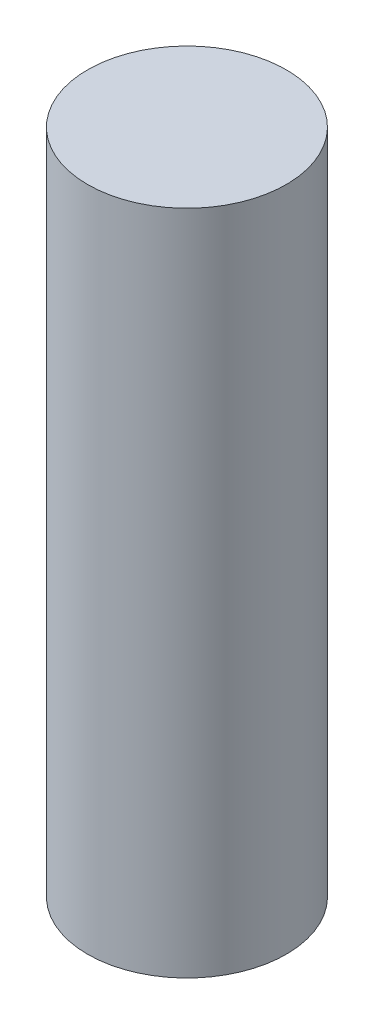
ISO-10303-21;
HEADER;
FILE_DESCRIPTION(('STEP AP214'),'2;1');
FILE_NAME('part.step','',(''),(''),'','','');
FILE_SCHEMA(('AUTOMOTIVE_DESIGN { 1 0 10303 214 1 1 1 1 }'));
ENDSEC;
DATA;
#1=APPLICATION_CONTEXT('core data for automotive mechanical design processes');
#2=APPLICATION_PROTOCOL_DEFINITION('international standard','automotive_design',2000,#1);
#3=PRODUCT_CONTEXT('',#1,'mechanical');
#4=PRODUCT('Part','Part','',(#3));
#5=PRODUCT_RELATED_PRODUCT_CATEGORY('part','',(#4));
#6=PRODUCT_DEFINITION_FORMATION('','',#4);
#7=PRODUCT_DEFINITION_CONTEXT('part definition',#1,'design');
#8=PRODUCT_DEFINITION('design','',#6,#7);
#9=PRODUCT_DEFINITION_SHAPE('','',#8);
#10=(LENGTH_UNIT() NAMED_UNIT(*) SI_UNIT(.MILLI.,.METRE.));
#11=(NAMED_UNIT(*) PLANE_ANGLE_UNIT() SI_UNIT($,.RADIAN.));
#12=(NAMED_UNIT(*) SI_UNIT($,.STERADIAN.) SOLID_ANGLE_UNIT());
#13=UNCERTAINTY_MEASURE_WITH_UNIT(LENGTH_MEASURE(1.E-05),#10,'distance_accuracy_value','');
#14=(GEOMETRIC_REPRESENTATION_CONTEXT(3) GLOBAL_UNCERTAINTY_ASSIGNED_CONTEXT((#13)) GLOBAL_UNIT_ASSIGNED_CONTEXT((#10,
#11,#12)) REPRESENTATION_CONTEXT('',''));
#15=CARTESIAN_POINT('',(0.,0.,0.));
#16=DIRECTION('',(0.,0.,1.));
#17=DIRECTION('',(1.,0.,0.));
#18=AXIS2_PLACEMENT_3D('',#15,#16,#17);
#19=CARTESIAN_POINT('',(0.,27.,0.));
#20=DIRECTION('',(0.,-1.,0.));
#21=DIRECTION('',(0.,0.,-1.));
#22=AXIS2_PLACEMENT_3D('',#19,#20,#21);
#23=CYLINDRICAL_SURFACE('',#22,4.025);
#24=CARTESIAN_POINT('',(0.,27.,0.));
#25=DIRECTION('',(0.,1.,0.));
#26=DIRECTION('',(0.,0.,1.));
#27=AXIS2_PLACEMENT_3D('',#24,#25,#26);
#28=CIRCLE('',#27,4.025);
#29=CARTESIAN_POINT('',(0.,27.,4.025));
#30=VERTEX_POINT('',#29);
#31=EDGE_CURVE('E10',#30,#30,#28,.T.);
#32=ORIENTED_EDGE('',*,*,#31,.F.);
#33=EDGE_LOOP('',(#32));
#34=FACE_BOUND('',#33,.T.);
#35=CARTESIAN_POINT('',(0.,0.,0.));
#36=DIRECTION('',(0.,1.,0.));
#37=DIRECTION('',(0.,0.,1.));
#38=AXIS2_PLACEMENT_3D('',#35,#36,#37);
#39=CIRCLE('',#38,4.025);
#40=CARTESIAN_POINT('',(0.,0.,4.025));
#41=VERTEX_POINT('',#40);
#42=EDGE_CURVE('E40',#41,#41,#39,.T.);
#43=ORIENTED_EDGE('',*,*,#42,.T.);
#44=EDGE_LOOP('',(#43));
#45=FACE_BOUND('',#44,.T.);
#46=ADVANCED_FACE('F37',(#34,#45),#23,.T.);
#47=CARTESIAN_POINT('',(0.,27.,0.));
#48=DIRECTION('',(0.,1.,0.));
#49=DIRECTION('',(0.,0.,1.));
#50=AXIS2_PLACEMENT_3D('',#47,#48,#49);
#51=PLANE('',#50);
#52=ORIENTED_EDGE('',*,*,#31,.T.);
#53=EDGE_LOOP('',(#52));
#54=FACE_BOUND('',#53,.T.);
#55=ADVANCED_FACE('F52',(#54),#51,.T.);
#56=CARTESIAN_POINT('',(0.,0.,0.));
#57=DIRECTION('',(0.,1.,0.));
#58=DIRECTION('',(0.,0.,1.));
#59=AXIS2_PLACEMENT_3D('',#56,#57,#58);
#60=PLANE('',#59);
#61=ORIENTED_EDGE('',*,*,#42,.F.);
#62=EDGE_LOOP('',(#61));
#63=FACE_BOUND('',#62,.T.);
#64=ADVANCED_FACE('F50',(#63),#60,.F.);
#65=CLOSED_SHELL('',(#46,#55,#64));
#66=MANIFOLD_SOLID_BREP('B2',#65);
#67=ADVANCED_BREP_SHAPE_REPRESENTATION('',(#18,#66),#14);
#68=SHAPE_DEFINITION_REPRESENTATION(#9,#67);
ENDSEC;
END-ISO-10303-21;
